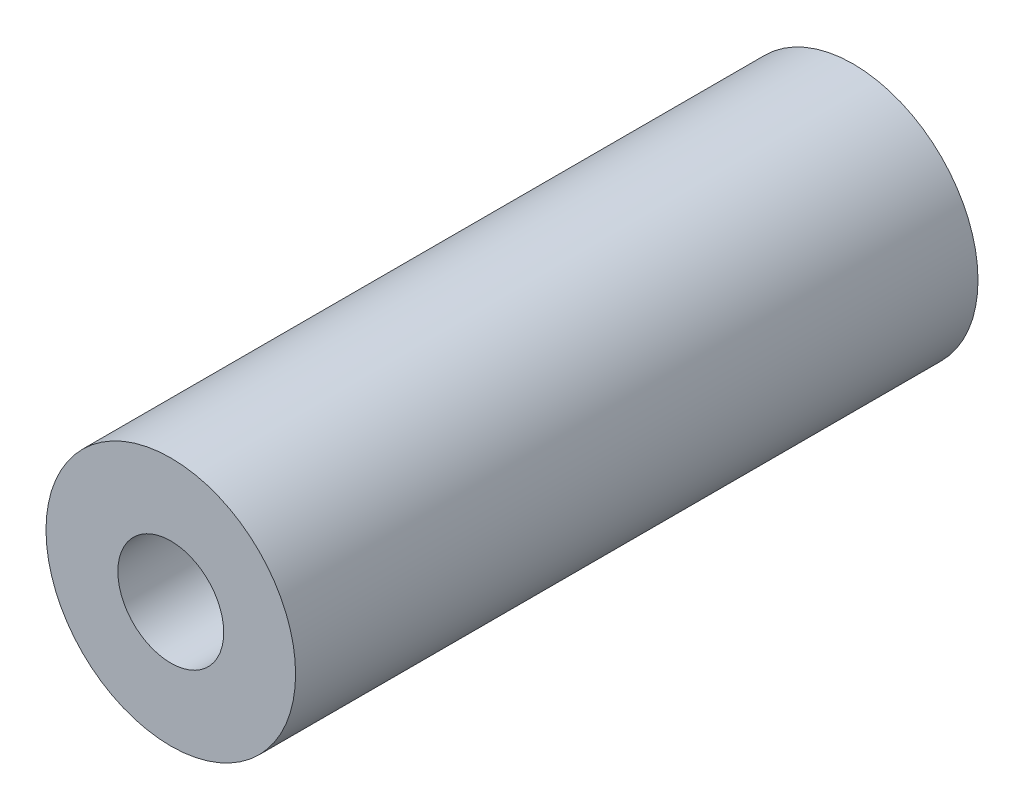
ISO-10303-21;
HEADER;
FILE_DESCRIPTION(('STEP AP214'),'2;1');
FILE_NAME('part.step','',(''),(''),'','','');
FILE_SCHEMA(('AUTOMOTIVE_DESIGN { 1 0 10303 214 1 1 1 1 }'));
ENDSEC;
DATA;
#1=APPLICATION_CONTEXT('core data for automotive mechanical design processes');
#2=APPLICATION_PROTOCOL_DEFINITION('international standard','automotive_design',2000,#1);
#3=PRODUCT_CONTEXT('',#1,'mechanical');
#4=PRODUCT('Part','Part','',(#3));
#5=PRODUCT_RELATED_PRODUCT_CATEGORY('part','',(#4));
#6=PRODUCT_DEFINITION_FORMATION('','',#4);
#7=PRODUCT_DEFINITION_CONTEXT('part definition',#1,'design');
#8=PRODUCT_DEFINITION('design','',#6,#7);
#9=PRODUCT_DEFINITION_SHAPE('','',#8);
#10=(LENGTH_UNIT() NAMED_UNIT(*) SI_UNIT(.MILLI.,.METRE.));
#11=(NAMED_UNIT(*) PLANE_ANGLE_UNIT() SI_UNIT($,.RADIAN.));
#12=(NAMED_UNIT(*) SI_UNIT($,.STERADIAN.) SOLID_ANGLE_UNIT());
#13=UNCERTAINTY_MEASURE_WITH_UNIT(LENGTH_MEASURE(1.E-05),#10,'distance_accuracy_value','');
#14=(GEOMETRIC_REPRESENTATION_CONTEXT(3) GLOBAL_UNCERTAINTY_ASSIGNED_CONTEXT((#13)) GLOBAL_UNIT_ASSIGNED_CONTEXT((#10,
#11,#12)) REPRESENTATION_CONTEXT('',''));
#15=CARTESIAN_POINT('',(0.,0.,0.));
#16=DIRECTION('',(0.,0.,1.));
#17=DIRECTION('',(1.,0.,0.));
#18=AXIS2_PLACEMENT_3D('',#15,#16,#17);
#19=CARTESIAN_POINT('',(0.,0.,13.02131));
#20=DIRECTION('',(0.,0.,-1.));
#21=DIRECTION('',(-1.,0.,0.));
#22=AXIS2_PLACEMENT_3D('',#19,#20,#21);
#23=CYLINDRICAL_SURFACE('',#22,4.7625);
#24=CARTESIAN_POINT('',(0.,0.,13.02131));
#25=DIRECTION('',(0.,0.,1.));
#26=DIRECTION('',(1.,0.,0.));
#27=AXIS2_PLACEMENT_3D('',#24,#25,#26);
#28=CIRCLE('',#27,4.7625);
#29=CARTESIAN_POINT('',(-4.7625,0.,13.02131));
#30=VERTEX_POINT('',#29);
#31=EDGE_CURVE('E10',#30,#30,#28,.T.);
#32=CARTESIAN_POINT('',(0.,0.,-13.02131));
#33=DIRECTION('',(0.,0.,1.));
#34=DIRECTION('',(1.,0.,0.));
#35=AXIS2_PLACEMENT_3D('',#32,#33,#34);
#36=CIRCLE('',#35,4.7625);
#37=CARTESIAN_POINT('',(-4.7625,0.,-13.02131));
#38=VERTEX_POINT('',#37);
#39=EDGE_CURVE('E44',#38,#38,#36,.T.);
#40=CARTESIAN_POINT('',(-4.7625,0.,13.02131));
#41=CARTESIAN_POINT('',(-4.7625,0.,12.7500327083333));
#42=CARTESIAN_POINT('',(-4.7625,0.,12.4787554166667));
#43=CARTESIAN_POINT('',(-4.7625,0.,11.9362008333333));
#44=CARTESIAN_POINT('',(-4.7625,0.,11.6649235416667));
#45=CARTESIAN_POINT('',(-4.7625,0.,11.1223689583333));
#46=CARTESIAN_POINT('',(-4.7625,0.,10.8510916666667));
#47=CARTESIAN_POINT('',(-4.7625,0.,10.3085370833333));
#48=CARTESIAN_POINT('',(-4.7625,0.,10.0372597916667));
#49=CARTESIAN_POINT('',(-4.7625,0.,9.49470520833333));
#50=CARTESIAN_POINT('',(-4.7625,0.,9.22342791666667));
#51=CARTESIAN_POINT('',(-4.7625,0.,8.68087333333333));
#52=CARTESIAN_POINT('',(-4.7625,0.,8.40959604166667));
#53=CARTESIAN_POINT('',(-4.7625,0.,7.86704145833333));
#54=CARTESIAN_POINT('',(-4.7625,0.,7.59576416666667));
#55=CARTESIAN_POINT('',(-4.7625,0.,7.05320958333333));
#56=CARTESIAN_POINT('',(-4.7625,0.,6.78193229166667));
#57=CARTESIAN_POINT('',(-4.7625,0.,6.23937770833333));
#58=CARTESIAN_POINT('',(-4.7625,0.,5.96810041666667));
#59=CARTESIAN_POINT('',(-4.7625,0.,5.42554583333333));
#60=CARTESIAN_POINT('',(-4.7625,0.,5.15426854166666));
#61=CARTESIAN_POINT('',(-4.7625,0.,4.61171395833333));
#62=CARTESIAN_POINT('',(-4.7625,0.,4.34043666666666));
#63=CARTESIAN_POINT('',(-4.7625,0.,3.79788208333333));
#64=CARTESIAN_POINT('',(-4.7625,0.,3.52660479166666));
#65=CARTESIAN_POINT('',(-4.7625,0.,2.98405020833333));
#66=CARTESIAN_POINT('',(-4.7625,0.,2.71277291666666));
#67=CARTESIAN_POINT('',(-4.7625,0.,2.17021833333333));
#68=CARTESIAN_POINT('',(-4.7625,0.,1.89894104166666));
#69=CARTESIAN_POINT('',(-4.7625,0.,1.35638645833333));
#70=CARTESIAN_POINT('',(-4.7625,0.,1.08510916666666));
#71=CARTESIAN_POINT('',(-4.7625,0.,0.54255458333333));
#72=CARTESIAN_POINT('',(-4.7625,0.,0.271277291666663));
#73=CARTESIAN_POINT('',(-4.7625,0.,-0.27127729166667));
#74=CARTESIAN_POINT('',(-4.7625,0.,-0.542554583333337));
#75=CARTESIAN_POINT('',(-4.7625,0.,-1.08510916666667));
#76=CARTESIAN_POINT('',(-4.7625,0.,-1.35638645833334));
#77=CARTESIAN_POINT('',(-4.7625,0.,-1.89894104166667));
#78=CARTESIAN_POINT('',(-4.7625,0.,-2.17021833333334));
#79=CARTESIAN_POINT('',(-4.7625,0.,-2.71277291666667));
#80=CARTESIAN_POINT('',(-4.7625,0.,-2.98405020833334));
#81=CARTESIAN_POINT('',(-4.7625,0.,-3.52660479166667));
#82=CARTESIAN_POINT('',(-4.7625,0.,-3.79788208333334));
#83=CARTESIAN_POINT('',(-4.7625,0.,-4.34043666666667));
#84=CARTESIAN_POINT('',(-4.7625,0.,-4.61171395833334));
#85=CARTESIAN_POINT('',(-4.7625,0.,-5.15426854166667));
#86=CARTESIAN_POINT('',(-4.7625,0.,-5.42554583333334));
#87=CARTESIAN_POINT('',(-4.7625,0.,-5.96810041666667));
#88=CARTESIAN_POINT('',(-4.7625,0.,-6.23937770833333));
#89=CARTESIAN_POINT('',(-4.7625,0.,-6.78193229166667));
#90=CARTESIAN_POINT('',(-4.7625,0.,-7.05320958333333));
#91=CARTESIAN_POINT('',(-4.7625,0.,-7.59576416666667));
#92=CARTESIAN_POINT('',(-4.7625,0.,-7.86704145833333));
#93=CARTESIAN_POINT('',(-4.7625,0.,-8.40959604166667));
#94=CARTESIAN_POINT('',(-4.7625,0.,-8.68087333333334));
#95=CARTESIAN_POINT('',(-4.7625,0.,-9.22342791666667));
#96=CARTESIAN_POINT('',(-4.7625,0.,-9.49470520833334));
#97=CARTESIAN_POINT('',(-4.7625,0.,-10.0372597916667));
#98=CARTESIAN_POINT('',(-4.7625,0.,-10.3085370833333));
#99=CARTESIAN_POINT('',(-4.7625,0.,-10.8510916666667));
#100=CARTESIAN_POINT('',(-4.7625,0.,-11.1223689583333));
#101=CARTESIAN_POINT('',(-4.7625,0.,-11.6649235416667));
#102=CARTESIAN_POINT('',(-4.7625,0.,-11.9362008333333));
#103=CARTESIAN_POINT('',(-4.7625,0.,-12.4787554166667));
#104=CARTESIAN_POINT('',(-4.7625,0.,-12.7500327083333));
#105=CARTESIAN_POINT('',(-4.7625,0.,-13.02131));
#106=B_SPLINE_CURVE_WITH_KNOTS('',3,(#40,#41,#42,#43,#44,#45,#46,#47,#48,#49,#50,#51,#52,#53,
#54,#55,#56,#57,#58,#59,#60,#61,#62,#63,#64,#65,#66,#67,#68,#69,#70,#71,#72,#73,#74,#75,#76,#77,
#78,#79,#80,#81,#82,#83,#84,#85,#86,#87,#88,#89,#90,#91,#92,#93,#94,#95,#96,#97,#98,#99,#100,
#101,#102,#103,#104,#105),.UNSPECIFIED.,.F.,.F.,(4,2,2,2,2,2,2,2,2,2,2,2,2,2,2,2,2,2,2,2,2,2,2,
2,2,2,2,2,2,2,2,2,4),(0.,0.813831874999999,1.62766375,2.441495625,3.2553275,4.069159375,
4.88299125,5.696823125,6.510655,7.324486875,8.13831875,8.952150625,9.7659825,10.579814375,
11.39364625,12.207478125,13.02131,13.835141875,14.64897375,15.462805625,16.2766375,17.090469375,
17.90430125,18.718133125,19.531965,20.345796875,21.15962875,21.973460625,22.7872925,
23.601124375,24.41495625,25.228788125,26.04262),.UNSPECIFIED.);
#107=EDGE_CURVE('BSEAM41',#30,#38,#106,.T.);
#108=ORIENTED_EDGE('',*,*,#31,.F.);
#109=ORIENTED_EDGE('',*,*,#39,.T.);
#110=ORIENTED_EDGE('',*,*,#107,.T.);
#111=ORIENTED_EDGE('',*,*,#107,.F.);
#112=EDGE_LOOP('',(#108,#110,#109,#111));
#113=FACE_BOUND('',#112,.T.);
#114=ADVANCED_FACE('F41',(#113),#23,.T.);
#115=CARTESIAN_POINT('',(0.,0.,13.02131));
#116=DIRECTION('',(0.,0.,1.));
#117=DIRECTION('',(1.,0.,0.));
#118=AXIS2_PLACEMENT_3D('',#115,#116,#117);
#119=PLANE('',#118);
#120=CARTESIAN_POINT('',(0.,0.,13.02131));
#121=DIRECTION('',(0.,0.,1.));
#122=DIRECTION('',(1.,0.,0.));
#123=AXIS2_PLACEMENT_3D('',#120,#121,#122);
#124=CIRCLE('',#123,2.01929999999999);
#125=CARTESIAN_POINT('',(2.01929999999999,0.,13.02131));
#126=VERTEX_POINT('',#125);
#127=EDGE_CURVE('E55',#126,#126,#124,.T.);
#128=ORIENTED_EDGE('',*,*,#127,.F.);
#129=EDGE_LOOP('',(#128));
#130=FACE_BOUND('',#129,.T.);
#131=ORIENTED_EDGE('',*,*,#31,.T.);
#132=EDGE_LOOP('',(#131));
#133=FACE_BOUND('',#132,.T.);
#134=ADVANCED_FACE('F61',(#130,#133),#119,.T.);
#135=CARTESIAN_POINT('',(0.,0.,-13.02131));
#136=DIRECTION('',(0.,0.,1.));
#137=DIRECTION('',(1.,0.,0.));
#138=AXIS2_PLACEMENT_3D('',#135,#136,#137);
#139=PLANE('',#138);
#140=CARTESIAN_POINT('',(0.,0.,-13.02131));
#141=DIRECTION('',(0.,0.,-1.));
#142=DIRECTION('',(-1.,0.,0.));
#143=AXIS2_PLACEMENT_3D('',#140,#141,#142);
#144=CIRCLE('',#143,2.01929999999999);
#145=CARTESIAN_POINT('',(-2.01929999999999,0.,-13.02131));
#146=VERTEX_POINT('',#145);
#147=EDGE_CURVE('E51',#146,#146,#144,.T.);
#148=ORIENTED_EDGE('',*,*,#147,.F.);
#149=EDGE_LOOP('',(#148));
#150=FACE_BOUND('',#149,.T.);
#151=ORIENTED_EDGE('',*,*,#39,.F.);
#152=EDGE_LOOP('',(#151));
#153=FACE_BOUND('',#152,.T.);
#154=ADVANCED_FACE('F63',(#150,#153),#139,.F.);
#155=CARTESIAN_POINT('',(0.,0.,-13.02131));
#156=DIRECTION('',(0.,0.,-1.));
#157=DIRECTION('',(-1.,0.,0.));
#158=AXIS2_PLACEMENT_3D('',#155,#156,#157);
#159=CYLINDRICAL_SURFACE('',#158,2.01929999999999);
#160=ORIENTED_EDGE('',*,*,#147,.T.);
#161=EDGE_LOOP('',(#160));
#162=FACE_BOUND('',#161,.T.);
#163=ORIENTED_EDGE('',*,*,#127,.T.);
#164=EDGE_LOOP('',(#163));
#165=FACE_BOUND('',#164,.T.);
#166=ADVANCED_FACE('F59',(#162,#165),#159,.F.);
#167=CLOSED_SHELL('',(#114,#134,#154,#166));
#168=MANIFOLD_SOLID_BREP('B2',#167);
#169=ADVANCED_BREP_SHAPE_REPRESENTATION('',(#18,#168),#14);
#170=SHAPE_DEFINITION_REPRESENTATION(#9,#169);
ENDSEC;
END-ISO-10303-21;
